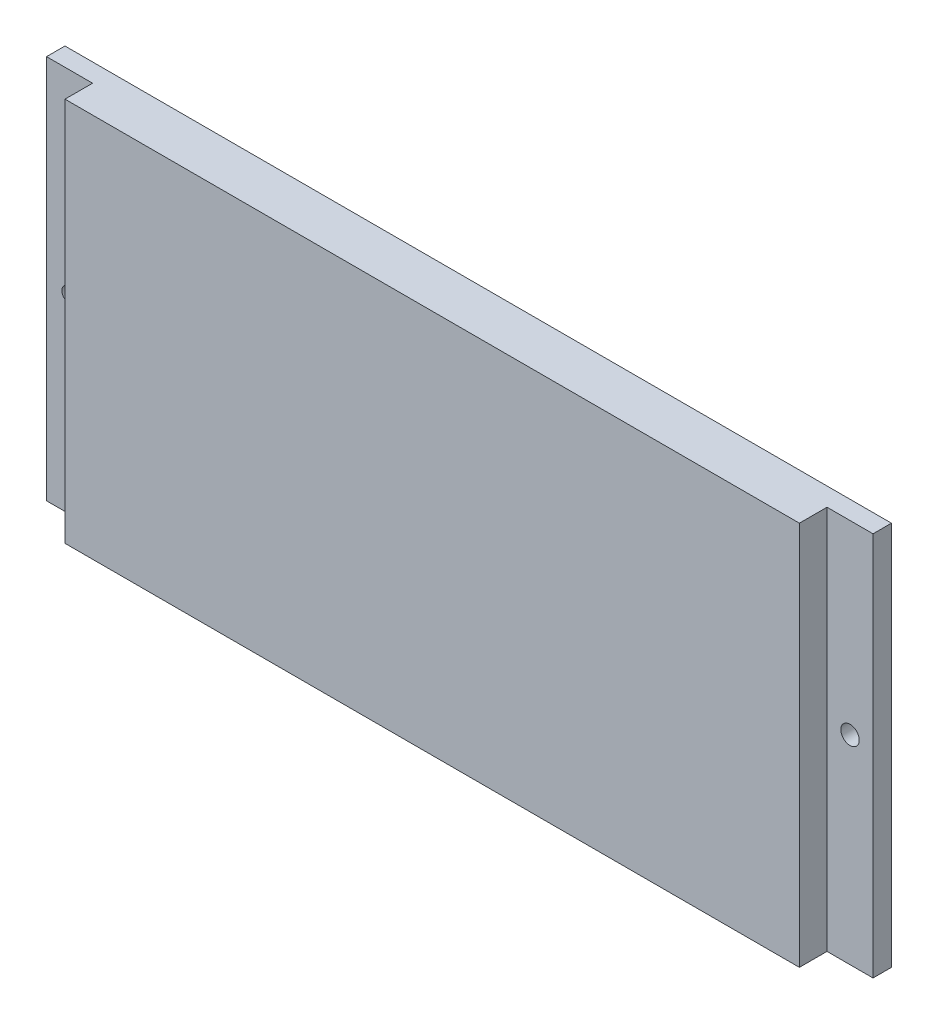
ISO-10303-21;
HEADER;
FILE_DESCRIPTION(('STEP AP214'),'2;1');
FILE_NAME('part.step','',(''),(''),'','','');
FILE_SCHEMA(('AUTOMOTIVE_DESIGN { 1 0 10303 214 1 1 1 1 }'));
ENDSEC;
DATA;
#1=APPLICATION_CONTEXT('core data for automotive mechanical design processes');
#2=APPLICATION_PROTOCOL_DEFINITION('international standard','automotive_design',2000,#1);
#3=PRODUCT_CONTEXT('',#1,'mechanical');
#4=PRODUCT('Part','Part','',(#3));
#5=PRODUCT_RELATED_PRODUCT_CATEGORY('part','',(#4));
#6=PRODUCT_DEFINITION_FORMATION('','',#4);
#7=PRODUCT_DEFINITION_CONTEXT('part definition',#1,'design');
#8=PRODUCT_DEFINITION('design','',#6,#7);
#9=PRODUCT_DEFINITION_SHAPE('','',#8);
#10=(LENGTH_UNIT() NAMED_UNIT(*) SI_UNIT(.MILLI.,.METRE.));
#11=(NAMED_UNIT(*) PLANE_ANGLE_UNIT() SI_UNIT($,.RADIAN.));
#12=(NAMED_UNIT(*) SI_UNIT($,.STERADIAN.) SOLID_ANGLE_UNIT());
#13=UNCERTAINTY_MEASURE_WITH_UNIT(LENGTH_MEASURE(1.E-05),#10,'distance_accuracy_value','');
#14=(GEOMETRIC_REPRESENTATION_CONTEXT(3) GLOBAL_UNCERTAINTY_ASSIGNED_CONTEXT((#13)) GLOBAL_UNIT_ASSIGNED_CONTEXT((#10,
#11,#12)) REPRESENTATION_CONTEXT('',''));
#15=CARTESIAN_POINT('',(0.,0.,0.));
#16=DIRECTION('',(0.,0.,1.));
#17=DIRECTION('',(1.,0.,0.));
#18=AXIS2_PLACEMENT_3D('',#15,#16,#17);
#19=CARTESIAN_POINT('',(-31.8582677165354,20.1732283464567,3.));
#20=DIRECTION('',(1.,0.,0.));
#21=DIRECTION('',(0.,0.,-1.));
#22=AXIS2_PLACEMENT_3D('',#19,#20,#21);
#23=PLANE('',#22);
#24=DIRECTION('',(0.,-1.,0.));
#25=VECTOR('',#24,1.);
#26=CARTESIAN_POINT('',(-31.8582677165354,20.1732283464567,0.));
#27=LINE('',#26,#25);
#28=CARTESIAN_POINT('',(-31.8582677165354,20.1732283464567,0.));
#29=VERTEX_POINT('',#28);
#30=CARTESIAN_POINT('',(-31.8582677165354,-21.6267716535433,0.));
#31=VERTEX_POINT('',#30);
#32=EDGE_CURVE('E133',#29,#31,#27,.T.);
#33=ORIENTED_EDGE('',*,*,#32,.T.);
#34=DIRECTION('',(0.,0.,-1.));
#35=VECTOR('',#34,1.);
#36=CARTESIAN_POINT('',(-31.8582677165354,-21.6267716535433,3.));
#37=LINE('',#36,#35);
#38=CARTESIAN_POINT('',(-31.8582677165354,-21.6267716535433,3.));
#39=VERTEX_POINT('',#38);
#40=EDGE_CURVE('E11',#39,#31,#37,.T.);
#41=ORIENTED_EDGE('',*,*,#40,.F.);
#42=DIRECTION('',(0.,-1.,0.));
#43=VECTOR('',#42,1.);
#44=CARTESIAN_POINT('',(-31.8582677165354,20.1732283464567,3.));
#45=LINE('',#44,#43);
#46=CARTESIAN_POINT('',(-31.8582677165354,20.1732283464567,3.));
#47=VERTEX_POINT('',#46);
#48=EDGE_CURVE('E144',#47,#39,#45,.T.);
#49=ORIENTED_EDGE('',*,*,#48,.F.);
#50=DIRECTION('',(0.,0.,-1.));
#51=VECTOR('',#50,1.);
#52=CARTESIAN_POINT('',(-31.8582677165354,20.1732283464567,3.));
#53=LINE('',#52,#51);
#54=EDGE_CURVE('E154',#47,#29,#53,.T.);
#55=ORIENTED_EDGE('',*,*,#54,.T.);
#56=EDGE_LOOP('',(#33,#41,#49,#55));
#57=FACE_BOUND('',#56,.T.);
#58=ADVANCED_FACE('F43',(#57),#23,.F.);
#59=CARTESIAN_POINT('',(-31.8582677165354,-21.6267716535433,3.));
#60=DIRECTION('',(0.,1.,0.));
#61=DIRECTION('',(0.,0.,1.));
#62=AXIS2_PLACEMENT_3D('',#59,#60,#61);
#63=PLANE('',#62);
#64=ORIENTED_EDGE('',*,*,#40,.T.);
#65=DIRECTION('',(-1.,0.,0.));
#66=VECTOR('',#65,1.);
#67=CARTESIAN_POINT('',(52.9417322834646,-21.6267716535433,0.));
#68=LINE('',#67,#66);
#69=CARTESIAN_POINT('',(-36.8582677165354,-21.6267716535433,0.));
#70=VERTEX_POINT('',#69);
#71=EDGE_CURVE('E176',#31,#70,#68,.T.);
#72=ORIENTED_EDGE('',*,*,#71,.T.);
#73=DIRECTION('',(0.,0.,1.));
#74=VECTOR('',#73,1.);
#75=CARTESIAN_POINT('',(-36.8582677165354,-21.6267716535433,-2.));
#76=LINE('',#75,#74);
#77=CARTESIAN_POINT('',(-36.8582677165354,-21.6267716535433,-2.));
#78=VERTEX_POINT('',#77);
#79=EDGE_CURVE('E112',#78,#70,#76,.T.);
#80=ORIENTED_EDGE('',*,*,#79,.F.);
#81=DIRECTION('',(-1.,0.,0.));
#82=VECTOR('',#81,1.);
#83=CARTESIAN_POINT('',(52.9417322834646,-21.6267716535433,-2.));
#84=LINE('',#83,#82);
#85=CARTESIAN_POINT('',(52.9417322834646,-21.6267716535433,-2.));
#86=VERTEX_POINT('',#85);
#87=EDGE_CURVE('E104',#86,#78,#84,.T.);
#88=ORIENTED_EDGE('',*,*,#87,.F.);
#89=DIRECTION('',(0.,0.,1.));
#90=VECTOR('',#89,1.);
#91=CARTESIAN_POINT('',(52.9417322834646,-21.6267716535433,-2.));
#92=LINE('',#91,#90);
#93=CARTESIAN_POINT('',(52.9417322834646,-21.6267716535433,0.));
#94=VERTEX_POINT('',#93);
#95=EDGE_CURVE('E109',#86,#94,#92,.T.);
#96=ORIENTED_EDGE('',*,*,#95,.T.);
#97=CARTESIAN_POINT('',(47.9417322834646,-21.6267716535433,0.));
#98=VERTEX_POINT('',#97);
#99=EDGE_CURVE('E172',#94,#98,#68,.T.);
#100=ORIENTED_EDGE('',*,*,#99,.T.);
#101=DIRECTION('',(0.,0.,-1.));
#102=VECTOR('',#101,1.);
#103=CARTESIAN_POINT('',(47.9417322834646,-21.6267716535433,3.));
#104=LINE('',#103,#102);
#105=CARTESIAN_POINT('',(47.9417322834646,-21.6267716535433,3.));
#106=VERTEX_POINT('',#105);
#107=EDGE_CURVE('E52',#106,#98,#104,.T.);
#108=ORIENTED_EDGE('',*,*,#107,.F.);
#109=DIRECTION('',(1.,0.,0.));
#110=VECTOR('',#109,1.);
#111=CARTESIAN_POINT('',(-31.8582677165354,-21.6267716535433,3.));
#112=LINE('',#111,#110);
#113=EDGE_CURVE('E147',#39,#106,#112,.T.);
#114=ORIENTED_EDGE('',*,*,#113,.F.);
#115=EDGE_LOOP('',(#64,#72,#80,#88,#96,#100,#108,#114));
#116=FACE_BOUND('',#115,.T.);
#117=ADVANCED_FACE('F106',(#116),#63,.F.);
#118=CARTESIAN_POINT('',(47.9417322834646,20.1732283464567,3.));
#119=DIRECTION('',(-1.,0.,0.));
#120=DIRECTION('',(0.,-1.,0.));
#121=AXIS2_PLACEMENT_3D('',#118,#119,#120);
#122=PLANE('',#121);
#123=DIRECTION('',(0.,1.,0.));
#124=VECTOR('',#123,1.);
#125=CARTESIAN_POINT('',(47.9417322834646,20.1732283464567,0.));
#126=LINE('',#125,#124);
#127=CARTESIAN_POINT('',(47.9417322834646,20.1732283464567,0.));
#128=VERTEX_POINT('',#127);
#129=EDGE_CURVE('E138',#98,#128,#126,.T.);
#130=ORIENTED_EDGE('',*,*,#129,.T.);
#131=DIRECTION('',(0.,0.,-1.));
#132=VECTOR('',#131,1.);
#133=CARTESIAN_POINT('',(47.9417322834646,20.1732283464567,3.));
#134=LINE('',#133,#132);
#135=CARTESIAN_POINT('',(47.9417322834646,20.1732283464567,3.));
#136=VERTEX_POINT('',#135);
#137=EDGE_CURVE('E162',#136,#128,#134,.T.);
#138=ORIENTED_EDGE('',*,*,#137,.F.);
#139=DIRECTION('',(0.,1.,0.));
#140=VECTOR('',#139,1.);
#141=CARTESIAN_POINT('',(47.9417322834646,20.1732283464567,3.));
#142=LINE('',#141,#140);
#143=EDGE_CURVE('E150',#106,#136,#142,.T.);
#144=ORIENTED_EDGE('',*,*,#143,.F.);
#145=ORIENTED_EDGE('',*,*,#107,.T.);
#146=EDGE_LOOP('',(#130,#138,#144,#145));
#147=FACE_BOUND('',#146,.T.);
#148=ADVANCED_FACE('F170',(#147),#122,.F.);
#149=CARTESIAN_POINT('',(-31.8582677165354,20.1732283464567,3.));
#150=DIRECTION('',(0.,-1.,0.));
#151=DIRECTION('',(0.,0.,-1.));
#152=AXIS2_PLACEMENT_3D('',#149,#150,#151);
#153=PLANE('',#152);
#154=ORIENTED_EDGE('',*,*,#137,.T.);
#155=DIRECTION('',(-1.,0.,0.));
#156=VECTOR('',#155,1.);
#157=CARTESIAN_POINT('',(52.9417322834646,20.1732283464567,0.));
#158=LINE('',#157,#156);
#159=CARTESIAN_POINT('',(52.9417322834646,20.1732283464567,0.));
#160=VERTEX_POINT('',#159);
#161=EDGE_CURVE('E127',#160,#128,#158,.T.);
#162=ORIENTED_EDGE('',*,*,#161,.F.);
#163=DIRECTION('',(0.,0.,1.));
#164=VECTOR('',#163,1.);
#165=CARTESIAN_POINT('',(52.9417322834646,20.1732283464567,-2.));
#166=LINE('',#165,#164);
#167=CARTESIAN_POINT('',(52.9417322834646,20.1732283464567,-2.));
#168=VERTEX_POINT('',#167);
#169=EDGE_CURVE('E189',#168,#160,#166,.T.);
#170=ORIENTED_EDGE('',*,*,#169,.F.);
#171=DIRECTION('',(-1.,0.,0.));
#172=VECTOR('',#171,1.);
#173=CARTESIAN_POINT('',(52.9417322834646,20.1732283464567,-2.));
#174=LINE('',#173,#172);
#175=CARTESIAN_POINT('',(-36.8582677165354,20.1732283464567,-2.));
#176=VERTEX_POINT('',#175);
#177=EDGE_CURVE('E124',#168,#176,#174,.T.);
#178=ORIENTED_EDGE('',*,*,#177,.T.);
#179=DIRECTION('',(0.,0.,1.));
#180=VECTOR('',#179,1.);
#181=CARTESIAN_POINT('',(-36.8582677165354,20.1732283464567,-2.));
#182=LINE('',#181,#180);
#183=CARTESIAN_POINT('',(-36.8582677165354,20.1732283464567,0.));
#184=VERTEX_POINT('',#183);
#185=EDGE_CURVE('E140',#176,#184,#182,.T.);
#186=ORIENTED_EDGE('',*,*,#185,.T.);
#187=EDGE_CURVE('E181',#29,#184,#158,.T.);
#188=ORIENTED_EDGE('',*,*,#187,.F.);
#189=ORIENTED_EDGE('',*,*,#54,.F.);
#190=DIRECTION('',(-1.,0.,0.));
#191=VECTOR('',#190,1.);
#192=CARTESIAN_POINT('',(-31.8582677165354,20.1732283464567,3.));
#193=LINE('',#192,#191);
#194=EDGE_CURVE('E59',#136,#47,#193,.T.);
#195=ORIENTED_EDGE('',*,*,#194,.F.);
#196=EDGE_LOOP('',(#154,#162,#170,#178,#186,#188,#189,#195));
#197=FACE_BOUND('',#196,.T.);
#198=ADVANCED_FACE('F196',(#197),#153,.F.);
#199=CARTESIAN_POINT('',(0.,0.,3.));
#200=DIRECTION('',(0.,0.,1.));
#201=DIRECTION('',(1.,0.,0.));
#202=AXIS2_PLACEMENT_3D('',#199,#200,#201);
#203=PLANE('',#202);
#204=ORIENTED_EDGE('',*,*,#48,.T.);
#205=ORIENTED_EDGE('',*,*,#113,.T.);
#206=ORIENTED_EDGE('',*,*,#143,.T.);
#207=ORIENTED_EDGE('',*,*,#194,.T.);
#208=EDGE_LOOP('',(#204,#205,#206,#207));
#209=FACE_BOUND('',#208,.T.);
#210=ADVANCED_FACE('F258',(#209),#203,.T.);
#211=CARTESIAN_POINT('',(0.,0.,0.));
#212=DIRECTION('',(0.,0.,-1.));
#213=DIRECTION('',(-1.,0.,0.));
#214=AXIS2_PLACEMENT_3D('',#211,#212,#213);
#215=PLANE('',#214);
#216=CARTESIAN_POINT('',(-34.3582677165354,-0.999999999999998,0.));
#217=DIRECTION('',(0.,0.,-1.));
#218=DIRECTION('',(-1.,0.,0.));
#219=AXIS2_PLACEMENT_3D('',#216,#217,#218);
#220=CIRCLE('',#219,0.833875983948588);
#221=CARTESIAN_POINT('',(-35.192143700484,-0.999999999999998,0.));
#222=VERTEX_POINT('',#221);
#223=EDGE_CURVE('E206',#222,#222,#220,.T.);
#224=ORIENTED_EDGE('',*,*,#223,.T.);
#225=EDGE_LOOP('',(#224));
#226=FACE_BOUND('',#225,.T.);
#227=ORIENTED_EDGE('',*,*,#32,.F.);
#228=ORIENTED_EDGE('',*,*,#187,.T.);
#229=DIRECTION('',(0.,-1.,0.));
#230=VECTOR('',#229,1.);
#231=CARTESIAN_POINT('',(-36.8582677165354,20.1732283464567,0.));
#232=LINE('',#231,#230);
#233=EDGE_CURVE('E175',#184,#70,#232,.T.);
#234=ORIENTED_EDGE('',*,*,#233,.T.);
#235=ORIENTED_EDGE('',*,*,#71,.F.);
#236=EDGE_LOOP('',(#227,#228,#234,#235));
#237=FACE_BOUND('',#236,.T.);
#238=ADVANCED_FACE('F200',(#226,#237),#215,.F.);
#239=CARTESIAN_POINT('',(52.9417322834646,20.1732283464567,-2.));
#240=DIRECTION('',(-1.,0.,0.));
#241=DIRECTION('',(0.,0.,1.));
#242=AXIS2_PLACEMENT_3D('',#239,#240,#241);
#243=PLANE('',#242);
#244=DIRECTION('',(0.,-1.,0.));
#245=VECTOR('',#244,1.);
#246=CARTESIAN_POINT('',(52.9417322834646,20.1732283464567,0.));
#247=LINE('',#246,#245);
#248=EDGE_CURVE('E131',#160,#94,#247,.T.);
#249=ORIENTED_EDGE('',*,*,#248,.T.);
#250=ORIENTED_EDGE('',*,*,#95,.F.);
#251=DIRECTION('',(0.,-1.,0.));
#252=VECTOR('',#251,1.);
#253=CARTESIAN_POINT('',(52.9417322834646,20.1732283464567,-2.));
#254=LINE('',#253,#252);
#255=EDGE_CURVE('E118',#168,#86,#254,.T.);
#256=ORIENTED_EDGE('',*,*,#255,.F.);
#257=ORIENTED_EDGE('',*,*,#169,.T.);
#258=EDGE_LOOP('',(#249,#250,#256,#257));
#259=FACE_BOUND('',#258,.T.);
#260=ADVANCED_FACE('F129',(#259),#243,.F.);
#261=CARTESIAN_POINT('',(-36.8582677165354,20.1732283464567,-2.));
#262=DIRECTION('',(-1.,0.,0.));
#263=DIRECTION('',(0.,-1.,0.));
#264=AXIS2_PLACEMENT_3D('',#261,#262,#263);
#265=PLANE('',#264);
#266=ORIENTED_EDGE('',*,*,#233,.F.);
#267=ORIENTED_EDGE('',*,*,#185,.F.);
#268=DIRECTION('',(0.,-1.,0.));
#269=VECTOR('',#268,1.);
#270=CARTESIAN_POINT('',(-36.8582677165354,20.1732283464567,-2.));
#271=LINE('',#270,#269);
#272=EDGE_CURVE('E117',#176,#78,#271,.T.);
#273=ORIENTED_EDGE('',*,*,#272,.T.);
#274=ORIENTED_EDGE('',*,*,#79,.T.);
#275=EDGE_LOOP('',(#266,#267,#273,#274));
#276=FACE_BOUND('',#275,.T.);
#277=ADVANCED_FACE('F198',(#276),#265,.T.);
#278=CARTESIAN_POINT('',(0.,0.,-2.));
#279=DIRECTION('',(0.,0.,-1.));
#280=DIRECTION('',(-1.,0.,0.));
#281=AXIS2_PLACEMENT_3D('',#278,#279,#280);
#282=PLANE('',#281);
#283=CARTESIAN_POINT('',(50.4417322834646,0.,-2.));
#284=DIRECTION('',(0.,0.,-1.));
#285=DIRECTION('',(-1.,0.,0.));
#286=AXIS2_PLACEMENT_3D('',#283,#284,#285);
#287=CIRCLE('',#286,0.999999999999998);
#288=CARTESIAN_POINT('',(49.4417322834646,0.,-2.));
#289=VERTEX_POINT('',#288);
#290=EDGE_CURVE('E214',#289,#289,#287,.T.);
#291=ORIENTED_EDGE('',*,*,#290,.F.);
#292=EDGE_LOOP('',(#291));
#293=FACE_BOUND('',#292,.T.);
#294=CARTESIAN_POINT('',(-34.3582677165354,-0.999999999999998,-2.));
#295=DIRECTION('',(0.,0.,-1.));
#296=DIRECTION('',(-1.,0.,0.));
#297=AXIS2_PLACEMENT_3D('',#294,#295,#296);
#298=CIRCLE('',#297,0.833875983948588);
#299=CARTESIAN_POINT('',(-35.192143700484,-0.999999999999998,-2.));
#300=VERTEX_POINT('',#299);
#301=EDGE_CURVE('E210',#300,#300,#298,.T.);
#302=ORIENTED_EDGE('',*,*,#301,.F.);
#303=EDGE_LOOP('',(#302));
#304=FACE_BOUND('',#303,.T.);
#305=ORIENTED_EDGE('',*,*,#255,.T.);
#306=ORIENTED_EDGE('',*,*,#87,.T.);
#307=ORIENTED_EDGE('',*,*,#272,.F.);
#308=ORIENTED_EDGE('',*,*,#177,.F.);
#309=EDGE_LOOP('',(#305,#306,#307,#308));
#310=FACE_BOUND('',#309,.T.);
#311=ADVANCED_FACE('F122',(#293,#304,#310),#282,.T.);
#312=CARTESIAN_POINT('',(50.4417322834646,0.,0.));
#313=DIRECTION('',(0.,0.,-1.));
#314=DIRECTION('',(-1.,0.,0.));
#315=AXIS2_PLACEMENT_3D('',#312,#313,#314);
#316=CIRCLE('',#315,0.999999999999998);
#317=CARTESIAN_POINT('',(49.4417322834646,0.,0.));
#318=VERTEX_POINT('',#317);
#319=EDGE_CURVE('E218',#318,#318,#316,.T.);
#320=ORIENTED_EDGE('',*,*,#319,.T.);
#321=EDGE_LOOP('',(#320));
#322=FACE_BOUND('',#321,.T.);
#323=ORIENTED_EDGE('',*,*,#129,.F.);
#324=ORIENTED_EDGE('',*,*,#99,.F.);
#325=ORIENTED_EDGE('',*,*,#248,.F.);
#326=ORIENTED_EDGE('',*,*,#161,.T.);
#327=EDGE_LOOP('',(#323,#324,#325,#326));
#328=FACE_BOUND('',#327,.T.);
#329=ADVANCED_FACE('F224',(#322,#328),#215,.F.);
#330=CARTESIAN_POINT('',(50.4417322834646,0.,0.));
#331=DIRECTION('',(0.,0.,-1.));
#332=DIRECTION('',(-1.,0.,0.));
#333=AXIS2_PLACEMENT_3D('',#330,#331,#332);
#334=CYLINDRICAL_SURFACE('',#333,0.999999999999998);
#335=ORIENTED_EDGE('',*,*,#319,.F.);
#336=EDGE_LOOP('',(#335));
#337=FACE_BOUND('',#336,.T.);
#338=ORIENTED_EDGE('',*,*,#290,.T.);
#339=EDGE_LOOP('',(#338));
#340=FACE_BOUND('',#339,.T.);
#341=ADVANCED_FACE('F226',(#337,#340),#334,.F.);
#342=CARTESIAN_POINT('',(-34.3582677165354,-0.999999999999998,0.));
#343=DIRECTION('',(0.,0.,-1.));
#344=DIRECTION('',(-1.,0.,0.));
#345=AXIS2_PLACEMENT_3D('',#342,#343,#344);
#346=CYLINDRICAL_SURFACE('',#345,0.833875983948588);
#347=ORIENTED_EDGE('',*,*,#223,.F.);
#348=EDGE_LOOP('',(#347));
#349=FACE_BOUND('',#348,.T.);
#350=ORIENTED_EDGE('',*,*,#301,.T.);
#351=EDGE_LOOP('',(#350));
#352=FACE_BOUND('',#351,.T.);
#353=ADVANCED_FACE('F229',(#349,#352),#346,.F.);
#354=CLOSED_SHELL('',(#58,#117,#148,#198,#210,#238,#260,#277,#311,#329,#341,#353));
#355=MANIFOLD_SOLID_BREP('B2',#354);
#356=ADVANCED_BREP_SHAPE_REPRESENTATION('',(#18,#355),#14);
#357=SHAPE_DEFINITION_REPRESENTATION(#9,#356);
ENDSEC;
END-ISO-10303-21;
